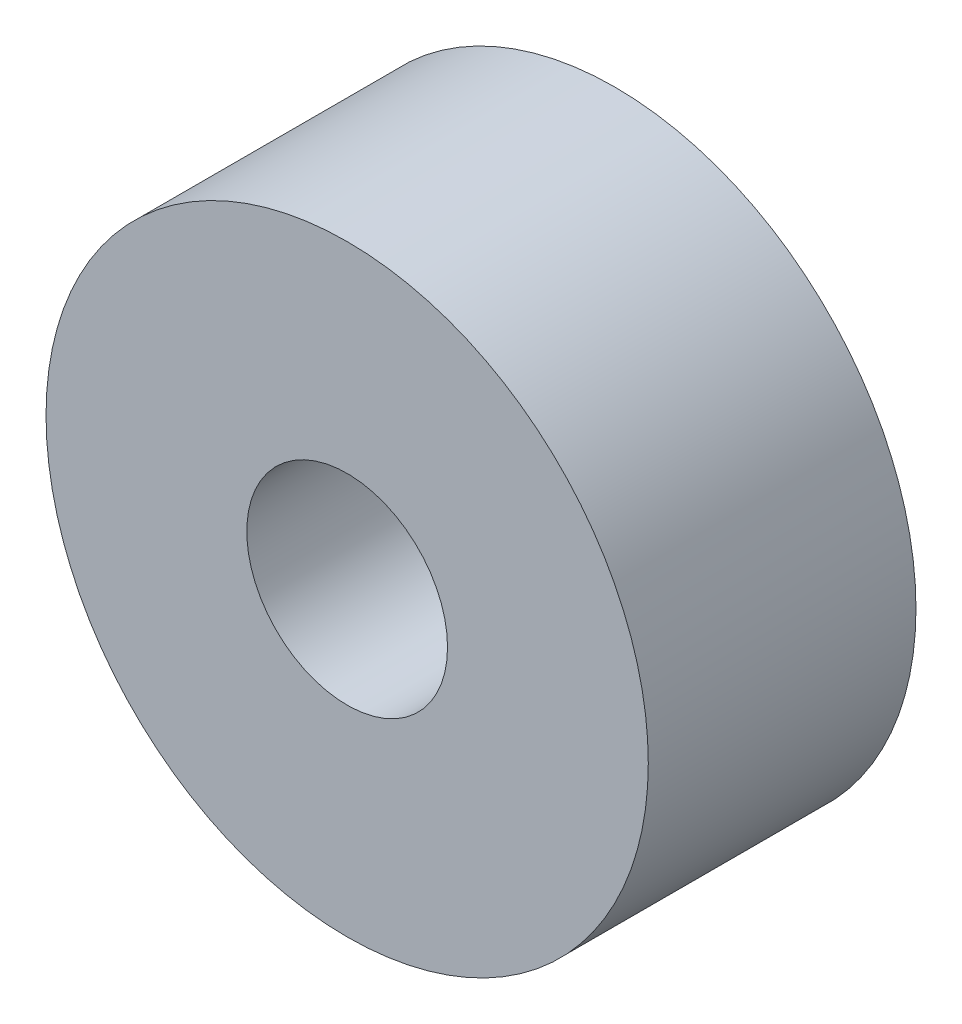
ISO-10303-21;
HEADER;
FILE_DESCRIPTION(('STEP AP214'),'2;1');
FILE_NAME('part.step','',(''),(''),'','','');
FILE_SCHEMA(('AUTOMOTIVE_DESIGN { 1 0 10303 214 1 1 1 1 }'));
ENDSEC;
DATA;
#1=APPLICATION_CONTEXT('core data for automotive mechanical design processes');
#2=APPLICATION_PROTOCOL_DEFINITION('international standard','automotive_design',2000,#1);
#3=PRODUCT_CONTEXT('',#1,'mechanical');
#4=PRODUCT('Part','Part','',(#3));
#5=PRODUCT_RELATED_PRODUCT_CATEGORY('part','',(#4));
#6=PRODUCT_DEFINITION_FORMATION('','',#4);
#7=PRODUCT_DEFINITION_CONTEXT('part definition',#1,'design');
#8=PRODUCT_DEFINITION('design','',#6,#7);
#9=PRODUCT_DEFINITION_SHAPE('','',#8);
#10=(LENGTH_UNIT() NAMED_UNIT(*) SI_UNIT(.MILLI.,.METRE.));
#11=(NAMED_UNIT(*) PLANE_ANGLE_UNIT() SI_UNIT($,.RADIAN.));
#12=(NAMED_UNIT(*) SI_UNIT($,.STERADIAN.) SOLID_ANGLE_UNIT());
#13=UNCERTAINTY_MEASURE_WITH_UNIT(LENGTH_MEASURE(1.E-05),#10,'distance_accuracy_value','');
#14=(GEOMETRIC_REPRESENTATION_CONTEXT(3) GLOBAL_UNCERTAINTY_ASSIGNED_CONTEXT((#13)) GLOBAL_UNIT_ASSIGNED_CONTEXT((#10,
#11,#12)) REPRESENTATION_CONTEXT('',''));
#15=CARTESIAN_POINT('',(0.,0.,0.));
#16=DIRECTION('',(0.,0.,1.));
#17=DIRECTION('',(1.,0.,0.));
#18=AXIS2_PLACEMENT_3D('',#15,#16,#17);
#19=CARTESIAN_POINT('',(0.,0.,4.));
#20=DIRECTION('',(0.,0.,1.));
#21=DIRECTION('',(1.,0.,0.));
#22=AXIS2_PLACEMENT_3D('',#19,#20,#21);
#23=PLANE('',#22);
#24=CARTESIAN_POINT('',(0.,0.,4.));
#25=DIRECTION('',(0.,0.,1.));
#26=DIRECTION('',(1.,0.,0.));
#27=AXIS2_PLACEMENT_3D('',#24,#25,#26);
#28=CIRCLE('',#27,4.5);
#29=CARTESIAN_POINT('',(4.5,0.,4.));
#30=VERTEX_POINT('',#29);
#31=EDGE_CURVE('E10',#30,#30,#28,.T.);
#32=ORIENTED_EDGE('',*,*,#31,.T.);
#33=EDGE_LOOP('',(#32));
#34=FACE_BOUND('',#33,.T.);
#35=CARTESIAN_POINT('',(0.,0.,4.));
#36=DIRECTION('',(0.,0.,1.));
#37=DIRECTION('',(1.,0.,0.));
#38=AXIS2_PLACEMENT_3D('',#35,#36,#37);
#39=CIRCLE('',#38,1.5);
#40=CARTESIAN_POINT('',(1.5,0.,4.));
#41=VERTEX_POINT('',#40);
#42=EDGE_CURVE('E42',#41,#41,#39,.T.);
#43=ORIENTED_EDGE('',*,*,#42,.F.);
#44=EDGE_LOOP('',(#43));
#45=FACE_BOUND('',#44,.T.);
#46=ADVANCED_FACE('F31',(#34,#45),#23,.T.);
#47=CARTESIAN_POINT('',(0.,0.,0.));
#48=DIRECTION('',(0.,0.,1.));
#49=DIRECTION('',(1.,0.,0.));
#50=AXIS2_PLACEMENT_3D('',#47,#48,#49);
#51=PLANE('',#50);
#52=CARTESIAN_POINT('',(0.,0.,0.));
#53=DIRECTION('',(0.,0.,1.));
#54=DIRECTION('',(1.,0.,0.));
#55=AXIS2_PLACEMENT_3D('',#52,#53,#54);
#56=CIRCLE('',#55,4.5);
#57=CARTESIAN_POINT('',(4.5,0.,0.));
#58=VERTEX_POINT('',#57);
#59=EDGE_CURVE('E35',#58,#58,#56,.T.);
#60=ORIENTED_EDGE('',*,*,#59,.F.);
#61=EDGE_LOOP('',(#60));
#62=FACE_BOUND('',#61,.T.);
#63=CARTESIAN_POINT('',(0.,0.,0.));
#64=DIRECTION('',(0.,0.,1.));
#65=DIRECTION('',(1.,0.,0.));
#66=AXIS2_PLACEMENT_3D('',#63,#64,#65);
#67=CIRCLE('',#66,1.5);
#68=CARTESIAN_POINT('',(1.5,0.,0.));
#69=VERTEX_POINT('',#68);
#70=EDGE_CURVE('E44',#69,#69,#67,.T.);
#71=ORIENTED_EDGE('',*,*,#70,.T.);
#72=EDGE_LOOP('',(#71));
#73=FACE_BOUND('',#72,.T.);
#74=ADVANCED_FACE('F54',(#62,#73),#51,.F.);
#75=CARTESIAN_POINT('',(0.,0.,4.));
#76=DIRECTION('',(0.,0.,-1.));
#77=DIRECTION('',(-1.,0.,0.));
#78=AXIS2_PLACEMENT_3D('',#75,#76,#77);
#79=CYLINDRICAL_SURFACE('',#78,4.5);
#80=ORIENTED_EDGE('',*,*,#31,.F.);
#81=EDGE_LOOP('',(#80));
#82=FACE_BOUND('',#81,.T.);
#83=ORIENTED_EDGE('',*,*,#59,.T.);
#84=EDGE_LOOP('',(#83));
#85=FACE_BOUND('',#84,.T.);
#86=ADVANCED_FACE('F33',(#82,#85),#79,.T.);
#87=CARTESIAN_POINT('',(0.,0.,4.));
#88=DIRECTION('',(0.,0.,-1.));
#89=DIRECTION('',(-1.,0.,0.));
#90=AXIS2_PLACEMENT_3D('',#87,#88,#89);
#91=CYLINDRICAL_SURFACE('',#90,1.5);
#92=ORIENTED_EDGE('',*,*,#42,.T.);
#93=EDGE_LOOP('',(#92));
#94=FACE_BOUND('',#93,.T.);
#95=ORIENTED_EDGE('',*,*,#70,.F.);
#96=EDGE_LOOP('',(#95));
#97=FACE_BOUND('',#96,.T.);
#98=ADVANCED_FACE('F50',(#94,#97),#91,.F.);
#99=CLOSED_SHELL('',(#46,#74,#86,#98));
#100=MANIFOLD_SOLID_BREP('B2',#99);
#101=ADVANCED_BREP_SHAPE_REPRESENTATION('',(#18,#100),#14);
#102=SHAPE_DEFINITION_REPRESENTATION(#9,#101);
ENDSEC;
END-ISO-10303-21;
